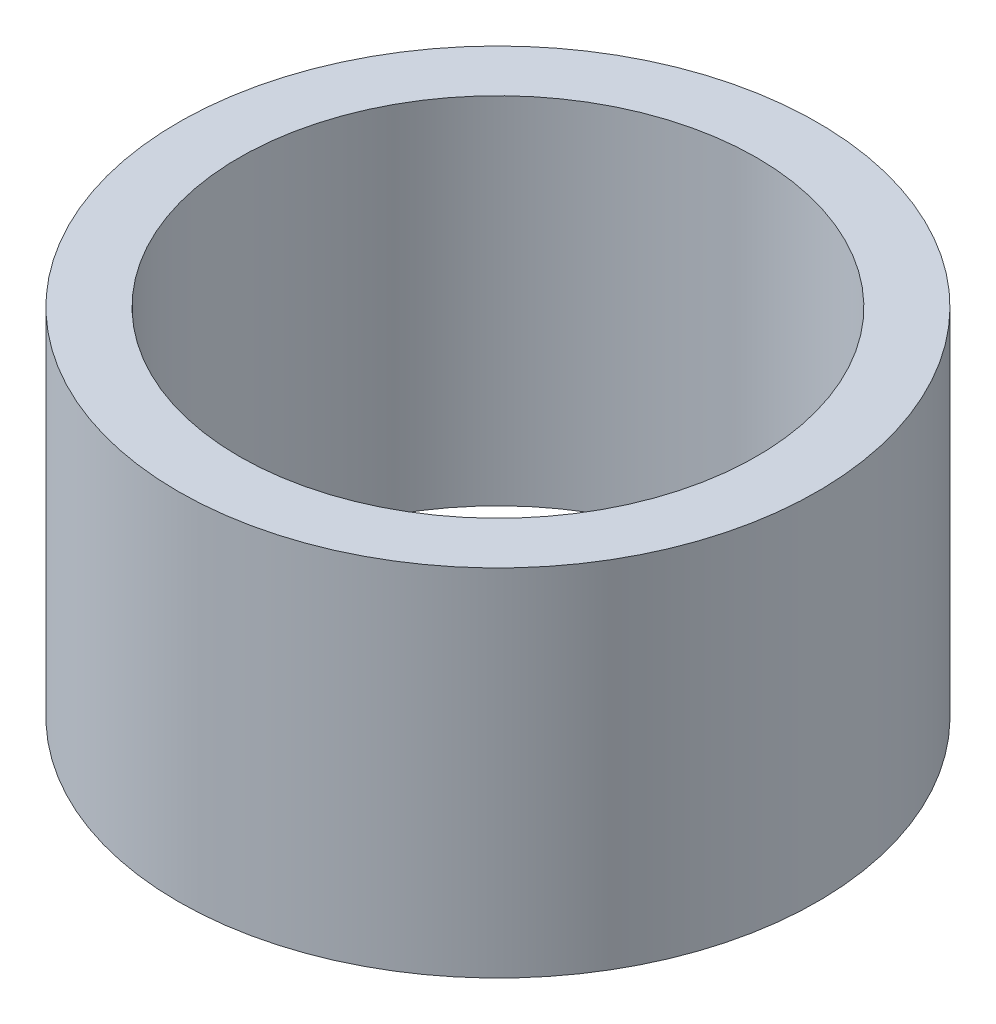
ISO-10303-21;
HEADER;
FILE_DESCRIPTION(('STEP AP214'),'2;1');
FILE_NAME('part.step','',(''),(''),'','','');
FILE_SCHEMA(('AUTOMOTIVE_DESIGN { 1 0 10303 214 1 1 1 1 }'));
ENDSEC;
DATA;
#1=APPLICATION_CONTEXT('core data for automotive mechanical design processes');
#2=APPLICATION_PROTOCOL_DEFINITION('international standard','automotive_design',2000,#1);
#3=PRODUCT_CONTEXT('',#1,'mechanical');
#4=PRODUCT('Part','Part','',(#3));
#5=PRODUCT_RELATED_PRODUCT_CATEGORY('part','',(#4));
#6=PRODUCT_DEFINITION_FORMATION('','',#4);
#7=PRODUCT_DEFINITION_CONTEXT('part definition',#1,'design');
#8=PRODUCT_DEFINITION('design','',#6,#7);
#9=PRODUCT_DEFINITION_SHAPE('','',#8);
#10=(LENGTH_UNIT() NAMED_UNIT(*) SI_UNIT(.MILLI.,.METRE.));
#11=(NAMED_UNIT(*) PLANE_ANGLE_UNIT() SI_UNIT($,.RADIAN.));
#12=(NAMED_UNIT(*) SI_UNIT($,.STERADIAN.) SOLID_ANGLE_UNIT());
#13=UNCERTAINTY_MEASURE_WITH_UNIT(LENGTH_MEASURE(1.E-05),#10,'distance_accuracy_value','');
#14=(GEOMETRIC_REPRESENTATION_CONTEXT(3) GLOBAL_UNCERTAINTY_ASSIGNED_CONTEXT((#13)) GLOBAL_UNIT_ASSIGNED_CONTEXT((#10,
#11,#12)) REPRESENTATION_CONTEXT('',''));
#15=CARTESIAN_POINT('',(0.,0.,0.));
#16=DIRECTION('',(0.,0.,1.));
#17=DIRECTION('',(1.,0.,0.));
#18=AXIS2_PLACEMENT_3D('',#15,#16,#17);
#19=CARTESIAN_POINT('',(0.,3.5,0.));
#20=DIRECTION('',(0.,1.,0.));
#21=DIRECTION('',(0.,0.,1.));
#22=AXIS2_PLACEMENT_3D('',#19,#20,#21);
#23=PLANE('',#22);
#24=CARTESIAN_POINT('',(0.,3.5,0.));
#25=DIRECTION('',(0.,1.,0.));
#26=DIRECTION('',(0.,0.,1.));
#27=AXIS2_PLACEMENT_3D('',#24,#25,#26);
#28=CIRCLE('',#27,3.15);
#29=CARTESIAN_POINT('',(0.,3.5,3.15));
#30=VERTEX_POINT('',#29);
#31=EDGE_CURVE('E10',#30,#30,#28,.T.);
#32=ORIENTED_EDGE('',*,*,#31,.T.);
#33=EDGE_LOOP('',(#32));
#34=FACE_BOUND('',#33,.T.);
#35=CARTESIAN_POINT('',(0.,3.5,0.));
#36=DIRECTION('',(0.,1.,0.));
#37=DIRECTION('',(0.,0.,1.));
#38=AXIS2_PLACEMENT_3D('',#35,#36,#37);
#39=CIRCLE('',#38,2.55);
#40=CARTESIAN_POINT('',(0.,3.5,2.55));
#41=VERTEX_POINT('',#40);
#42=EDGE_CURVE('E42',#41,#41,#39,.T.);
#43=ORIENTED_EDGE('',*,*,#42,.F.);
#44=EDGE_LOOP('',(#43));
#45=FACE_BOUND('',#44,.T.);
#46=ADVANCED_FACE('F31',(#34,#45),#23,.T.);
#47=CARTESIAN_POINT('',(0.,0.,0.));
#48=DIRECTION('',(0.,1.,0.));
#49=DIRECTION('',(0.,0.,1.));
#50=AXIS2_PLACEMENT_3D('',#47,#48,#49);
#51=PLANE('',#50);
#52=CARTESIAN_POINT('',(0.,0.,0.));
#53=DIRECTION('',(0.,1.,0.));
#54=DIRECTION('',(0.,0.,1.));
#55=AXIS2_PLACEMENT_3D('',#52,#53,#54);
#56=CIRCLE('',#55,3.15);
#57=CARTESIAN_POINT('',(0.,0.,3.15));
#58=VERTEX_POINT('',#57);
#59=EDGE_CURVE('E35',#58,#58,#56,.T.);
#60=ORIENTED_EDGE('',*,*,#59,.F.);
#61=EDGE_LOOP('',(#60));
#62=FACE_BOUND('',#61,.T.);
#63=CARTESIAN_POINT('',(0.,0.,0.));
#64=DIRECTION('',(0.,1.,0.));
#65=DIRECTION('',(0.,0.,1.));
#66=AXIS2_PLACEMENT_3D('',#63,#64,#65);
#67=CIRCLE('',#66,2.55);
#68=CARTESIAN_POINT('',(0.,0.,2.55));
#69=VERTEX_POINT('',#68);
#70=EDGE_CURVE('E44',#69,#69,#67,.T.);
#71=ORIENTED_EDGE('',*,*,#70,.T.);
#72=EDGE_LOOP('',(#71));
#73=FACE_BOUND('',#72,.T.);
#74=ADVANCED_FACE('F54',(#62,#73),#51,.F.);
#75=CARTESIAN_POINT('',(0.,3.5,0.));
#76=DIRECTION('',(0.,-1.,0.));
#77=DIRECTION('',(0.,0.,-1.));
#78=AXIS2_PLACEMENT_3D('',#75,#76,#77);
#79=CYLINDRICAL_SURFACE('',#78,3.15);
#80=ORIENTED_EDGE('',*,*,#31,.F.);
#81=EDGE_LOOP('',(#80));
#82=FACE_BOUND('',#81,.T.);
#83=ORIENTED_EDGE('',*,*,#59,.T.);
#84=EDGE_LOOP('',(#83));
#85=FACE_BOUND('',#84,.T.);
#86=ADVANCED_FACE('F33',(#82,#85),#79,.T.);
#87=CARTESIAN_POINT('',(0.,3.5,0.));
#88=DIRECTION('',(0.,-1.,0.));
#89=DIRECTION('',(0.,0.,-1.));
#90=AXIS2_PLACEMENT_3D('',#87,#88,#89);
#91=CYLINDRICAL_SURFACE('',#90,2.55);
#92=ORIENTED_EDGE('',*,*,#42,.T.);
#93=EDGE_LOOP('',(#92));
#94=FACE_BOUND('',#93,.T.);
#95=ORIENTED_EDGE('',*,*,#70,.F.);
#96=EDGE_LOOP('',(#95));
#97=FACE_BOUND('',#96,.T.);
#98=ADVANCED_FACE('F50',(#94,#97),#91,.F.);
#99=CLOSED_SHELL('',(#46,#74,#86,#98));
#100=MANIFOLD_SOLID_BREP('B2',#99);
#101=ADVANCED_BREP_SHAPE_REPRESENTATION('',(#18,#100),#14);
#102=SHAPE_DEFINITION_REPRESENTATION(#9,#101);
ENDSEC;
END-ISO-10303-21;
